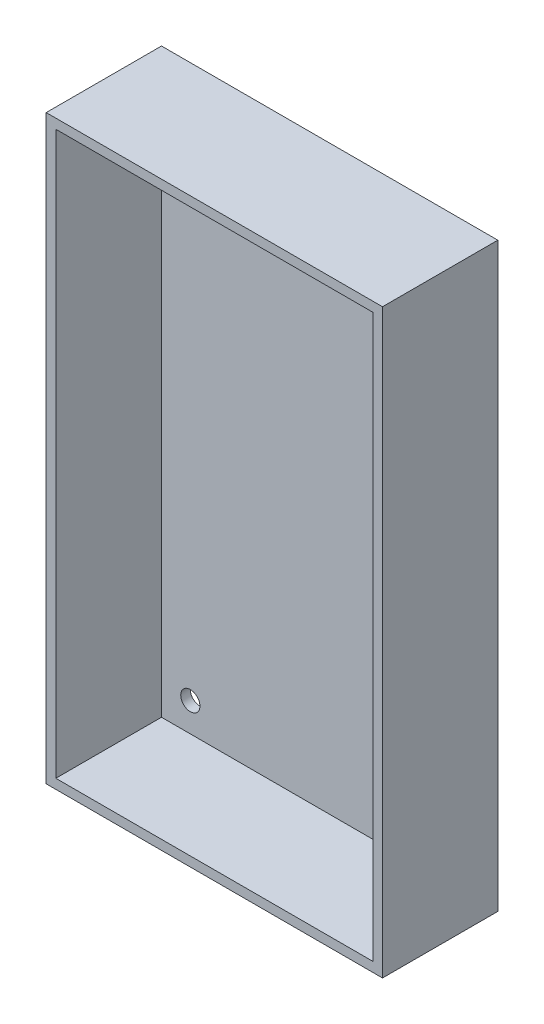
ISO-10303-21;
HEADER;
FILE_DESCRIPTION(('STEP AP214'),'2;1');
FILE_NAME('part.step','',(''),(''),'','','');
FILE_SCHEMA(('AUTOMOTIVE_DESIGN { 1 0 10303 214 1 1 1 1 }'));
ENDSEC;
DATA;
#1=APPLICATION_CONTEXT('core data for automotive mechanical design processes');
#2=APPLICATION_PROTOCOL_DEFINITION('international standard','automotive_design',2000,#1);
#3=PRODUCT_CONTEXT('',#1,'mechanical');
#4=PRODUCT('Part','Part','',(#3));
#5=PRODUCT_RELATED_PRODUCT_CATEGORY('part','',(#4));
#6=PRODUCT_DEFINITION_FORMATION('','',#4);
#7=PRODUCT_DEFINITION_CONTEXT('part definition',#1,'design');
#8=PRODUCT_DEFINITION('design','',#6,#7);
#9=PRODUCT_DEFINITION_SHAPE('','',#8);
#10=(LENGTH_UNIT() NAMED_UNIT(*) SI_UNIT(.MILLI.,.METRE.));
#11=(NAMED_UNIT(*) PLANE_ANGLE_UNIT() SI_UNIT($,.RADIAN.));
#12=(NAMED_UNIT(*) SI_UNIT($,.STERADIAN.) SOLID_ANGLE_UNIT());
#13=UNCERTAINTY_MEASURE_WITH_UNIT(LENGTH_MEASURE(1.E-05),#10,'distance_accuracy_value','');
#14=(GEOMETRIC_REPRESENTATION_CONTEXT(3) GLOBAL_UNCERTAINTY_ASSIGNED_CONTEXT((#13)) GLOBAL_UNIT_ASSIGNED_CONTEXT((#10,
#11,#12)) REPRESENTATION_CONTEXT('',''));
#15=CARTESIAN_POINT('',(0.,0.,0.));
#16=DIRECTION('',(0.,0.,1.));
#17=DIRECTION('',(1.,0.,0.));
#18=AXIS2_PLACEMENT_3D('',#15,#16,#17);
#19=CARTESIAN_POINT('',(-35.,60.5,2.));
#20=DIRECTION('',(0.,1.,0.));
#21=DIRECTION('',(0.,0.,1.));
#22=AXIS2_PLACEMENT_3D('',#19,#20,#21);
#23=PLANE('',#22);
#24=DIRECTION('',(1.,0.,0.));
#25=VECTOR('',#24,1.);
#26=CARTESIAN_POINT('',(-35.,60.5,0.));
#27=LINE('',#26,#25);
#28=CARTESIAN_POINT('',(-35.,60.5,0.));
#29=VERTEX_POINT('',#28);
#30=CARTESIAN_POINT('',(35.,60.5,0.));
#31=VERTEX_POINT('',#30);
#32=EDGE_CURVE('E189',#29,#31,#27,.T.);
#33=ORIENTED_EDGE('',*,*,#32,.F.);
#34=DIRECTION('',(0.,0.,-1.));
#35=VECTOR('',#34,1.);
#36=CARTESIAN_POINT('',(-35.,60.5,2.));
#37=LINE('',#36,#35);
#38=CARTESIAN_POINT('',(-35.,60.5,24.));
#39=VERTEX_POINT('',#38);
#40=EDGE_CURVE('E11',#39,#29,#37,.T.);
#41=ORIENTED_EDGE('',*,*,#40,.F.);
#42=DIRECTION('',(-1.,0.,0.));
#43=VECTOR('',#42,1.);
#44=CARTESIAN_POINT('',(0.,60.5,24.));
#45=LINE('',#44,#43);
#46=CARTESIAN_POINT('',(35.,60.5,24.));
#47=VERTEX_POINT('',#46);
#48=EDGE_CURVE('E127',#47,#39,#45,.T.);
#49=ORIENTED_EDGE('',*,*,#48,.F.);
#50=DIRECTION('',(0.,0.,-1.));
#51=VECTOR('',#50,1.);
#52=CARTESIAN_POINT('',(35.,60.5,2.));
#53=LINE('',#52,#51);
#54=EDGE_CURVE('E112',#47,#31,#53,.T.);
#55=ORIENTED_EDGE('',*,*,#54,.T.);
#56=EDGE_LOOP('',(#33,#41,#49,#55));
#57=FACE_BOUND('',#56,.T.);
#58=ADVANCED_FACE('F47',(#57),#23,.T.);
#59=CARTESIAN_POINT('',(-35.,60.5,2.));
#60=DIRECTION('',(1.,0.,0.));
#61=DIRECTION('',(0.,1.,0.));
#62=AXIS2_PLACEMENT_3D('',#59,#60,#61);
#63=PLANE('',#62);
#64=DIRECTION('',(0.,-1.,0.));
#65=VECTOR('',#64,1.);
#66=CARTESIAN_POINT('',(-35.,60.5,0.));
#67=LINE('',#66,#65);
#68=CARTESIAN_POINT('',(-35.,-60.5,0.));
#69=VERTEX_POINT('',#68);
#70=EDGE_CURVE('E124',#29,#69,#67,.T.);
#71=ORIENTED_EDGE('',*,*,#70,.T.);
#72=DIRECTION('',(0.,0.,-1.));
#73=VECTOR('',#72,1.);
#74=CARTESIAN_POINT('',(-35.,-60.5,2.));
#75=LINE('',#74,#73);
#76=CARTESIAN_POINT('',(-35.,-60.5,24.));
#77=VERTEX_POINT('',#76);
#78=EDGE_CURVE('E56',#77,#69,#75,.T.);
#79=ORIENTED_EDGE('',*,*,#78,.F.);
#80=DIRECTION('',(0.,-1.,0.));
#81=VECTOR('',#80,1.);
#82=CARTESIAN_POINT('',(-35.,0.,24.));
#83=LINE('',#82,#81);
#84=EDGE_CURVE('E131',#39,#77,#83,.T.);
#85=ORIENTED_EDGE('',*,*,#84,.F.);
#86=ORIENTED_EDGE('',*,*,#40,.T.);
#87=EDGE_LOOP('',(#71,#79,#85,#86));
#88=FACE_BOUND('',#87,.T.);
#89=ADVANCED_FACE('F237',(#88),#63,.F.);
#90=CARTESIAN_POINT('',(-35.,-60.5,2.));
#91=DIRECTION('',(0.,1.,0.));
#92=DIRECTION('',(0.,0.,1.));
#93=AXIS2_PLACEMENT_3D('',#90,#91,#92);
#94=PLANE('',#93);
#95=DIRECTION('',(1.,0.,0.));
#96=VECTOR('',#95,1.);
#97=CARTESIAN_POINT('',(-35.,-60.5,0.));
#98=LINE('',#97,#96);
#99=CARTESIAN_POINT('',(35.,-60.5,0.));
#100=VERTEX_POINT('',#99);
#101=EDGE_CURVE('E194',#69,#100,#98,.T.);
#102=ORIENTED_EDGE('',*,*,#101,.T.);
#103=DIRECTION('',(0.,0.,-1.));
#104=VECTOR('',#103,1.);
#105=CARTESIAN_POINT('',(35.,-60.5,2.));
#106=LINE('',#105,#104);
#107=CARTESIAN_POINT('',(35.,-60.5,24.));
#108=VERTEX_POINT('',#107);
#109=EDGE_CURVE('E123',#108,#100,#106,.T.);
#110=ORIENTED_EDGE('',*,*,#109,.F.);
#111=DIRECTION('',(1.,0.,0.));
#112=VECTOR('',#111,1.);
#113=CARTESIAN_POINT('',(0.,-60.5,24.));
#114=LINE('',#113,#112);
#115=EDGE_CURVE('E137',#77,#108,#114,.T.);
#116=ORIENTED_EDGE('',*,*,#115,.F.);
#117=ORIENTED_EDGE('',*,*,#78,.T.);
#118=EDGE_LOOP('',(#102,#110,#116,#117));
#119=FACE_BOUND('',#118,.T.);
#120=ADVANCED_FACE('F241',(#119),#94,.F.);
#121=CARTESIAN_POINT('',(35.,60.5,2.));
#122=DIRECTION('',(1.,0.,0.));
#123=DIRECTION('',(0.,0.,-1.));
#124=AXIS2_PLACEMENT_3D('',#121,#122,#123);
#125=PLANE('',#124);
#126=DIRECTION('',(0.,-1.,0.));
#127=VECTOR('',#126,1.);
#128=CARTESIAN_POINT('',(35.,60.5,0.));
#129=LINE('',#128,#127);
#130=EDGE_CURVE('E118',#31,#100,#129,.T.);
#131=ORIENTED_EDGE('',*,*,#130,.F.);
#132=ORIENTED_EDGE('',*,*,#54,.F.);
#133=DIRECTION('',(0.,1.,0.));
#134=VECTOR('',#133,1.);
#135=CARTESIAN_POINT('',(35.,0.,24.));
#136=LINE('',#135,#134);
#137=EDGE_CURVE('E116',#108,#47,#136,.T.);
#138=ORIENTED_EDGE('',*,*,#137,.F.);
#139=ORIENTED_EDGE('',*,*,#109,.T.);
#140=EDGE_LOOP('',(#131,#132,#138,#139));
#141=FACE_BOUND('',#140,.T.);
#142=ADVANCED_FACE('F114',(#141),#125,.T.);
#143=CARTESIAN_POINT('',(0.,0.,0.));
#144=DIRECTION('',(0.,0.,-1.));
#145=DIRECTION('',(-1.,0.,0.));
#146=AXIS2_PLACEMENT_3D('',#143,#144,#145);
#147=PLANE('',#146);
#148=CARTESIAN_POINT('',(-27.,52.5,0.));
#149=DIRECTION('',(0.,0.,-1.));
#150=DIRECTION('',(1.,0.,0.));
#151=AXIS2_PLACEMENT_3D('',#148,#149,#150);
#152=CIRCLE('',#151,2.);
#153=CARTESIAN_POINT('',(-25.,52.5,0.));
#154=VERTEX_POINT('',#153);
#155=EDGE_CURVE('E267',#154,#154,#152,.T.);
#156=ORIENTED_EDGE('',*,*,#155,.F.);
#157=EDGE_LOOP('',(#156));
#158=FACE_BOUND('',#157,.T.);
#159=CARTESIAN_POINT('',(-27.,-52.5,0.));
#160=DIRECTION('',(0.,0.,-1.));
#161=DIRECTION('',(-1.,0.,0.));
#162=AXIS2_PLACEMENT_3D('',#159,#160,#161);
#163=CIRCLE('',#162,2.);
#164=CARTESIAN_POINT('',(-29.,-52.5,0.));
#165=VERTEX_POINT('',#164);
#166=EDGE_CURVE('E271',#165,#165,#163,.T.);
#167=ORIENTED_EDGE('',*,*,#166,.F.);
#168=EDGE_LOOP('',(#167));
#169=FACE_BOUND('',#168,.T.);
#170=CARTESIAN_POINT('',(27.,-52.5,0.));
#171=DIRECTION('',(0.,0.,-1.));
#172=DIRECTION('',(1.,0.,0.));
#173=AXIS2_PLACEMENT_3D('',#170,#171,#172);
#174=CIRCLE('',#173,2.);
#175=CARTESIAN_POINT('',(29.,-52.5,0.));
#176=VERTEX_POINT('',#175);
#177=EDGE_CURVE('E275',#176,#176,#174,.T.);
#178=ORIENTED_EDGE('',*,*,#177,.F.);
#179=EDGE_LOOP('',(#178));
#180=FACE_BOUND('',#179,.T.);
#181=CARTESIAN_POINT('',(27.,52.5,0.));
#182=DIRECTION('',(0.,0.,-1.));
#183=DIRECTION('',(-1.,0.,0.));
#184=AXIS2_PLACEMENT_3D('',#181,#182,#183);
#185=CIRCLE('',#184,2.);
#186=CARTESIAN_POINT('',(25.,52.5,0.));
#187=VERTEX_POINT('',#186);
#188=EDGE_CURVE('E145',#187,#187,#185,.T.);
#189=ORIENTED_EDGE('',*,*,#188,.F.);
#190=EDGE_LOOP('',(#189));
#191=FACE_BOUND('',#190,.T.);
#192=ORIENTED_EDGE('',*,*,#32,.T.);
#193=ORIENTED_EDGE('',*,*,#130,.T.);
#194=ORIENTED_EDGE('',*,*,#101,.F.);
#195=ORIENTED_EDGE('',*,*,#70,.F.);
#196=EDGE_LOOP('',(#192,#193,#194,#195));
#197=FACE_BOUND('',#196,.T.);
#198=ADVANCED_FACE('F249',(#158,#169,#180,#191,#197),#147,.T.);
#199=CARTESIAN_POINT('',(0.,58.5,24.));
#200=DIRECTION('',(0.,1.,0.));
#201=DIRECTION('',(0.,0.,1.));
#202=AXIS2_PLACEMENT_3D('',#199,#200,#201);
#203=PLANE('',#202);
#204=DIRECTION('',(1.,0.,0.));
#205=VECTOR('',#204,1.);
#206=CARTESIAN_POINT('',(0.,58.5,2.));
#207=LINE('',#206,#205);
#208=CARTESIAN_POINT('',(-33.,58.5,2.));
#209=VERTEX_POINT('',#208);
#210=CARTESIAN_POINT('',(33.,58.5,2.));
#211=VERTEX_POINT('',#210);
#212=EDGE_CURVE('E168',#209,#211,#207,.T.);
#213=ORIENTED_EDGE('',*,*,#212,.T.);
#214=DIRECTION('',(0.,0.,-1.));
#215=VECTOR('',#214,1.);
#216=CARTESIAN_POINT('',(33.,58.5,24.));
#217=LINE('',#216,#215);
#218=CARTESIAN_POINT('',(33.,58.5,24.));
#219=VERTEX_POINT('',#218);
#220=EDGE_CURVE('E186',#219,#211,#217,.T.);
#221=ORIENTED_EDGE('',*,*,#220,.F.);
#222=DIRECTION('',(1.,0.,0.));
#223=VECTOR('',#222,1.);
#224=CARTESIAN_POINT('',(0.,58.5,24.));
#225=LINE('',#224,#223);
#226=CARTESIAN_POINT('',(-33.,58.5,24.));
#227=VERTEX_POINT('',#226);
#228=EDGE_CURVE('E152',#227,#219,#225,.T.);
#229=ORIENTED_EDGE('',*,*,#228,.F.);
#230=DIRECTION('',(0.,0.,-1.));
#231=VECTOR('',#230,1.);
#232=CARTESIAN_POINT('',(-33.,58.5,24.));
#233=LINE('',#232,#231);
#234=EDGE_CURVE('E167',#227,#209,#233,.T.);
#235=ORIENTED_EDGE('',*,*,#234,.T.);
#236=EDGE_LOOP('',(#213,#221,#229,#235));
#237=FACE_BOUND('',#236,.T.);
#238=ADVANCED_FACE('F256',(#237),#203,.F.);
#239=CARTESIAN_POINT('',(33.,0.,24.));
#240=DIRECTION('',(1.,0.,0.));
#241=DIRECTION('',(0.,0.,-1.));
#242=AXIS2_PLACEMENT_3D('',#239,#240,#241);
#243=PLANE('',#242);
#244=DIRECTION('',(0.,-1.,0.));
#245=VECTOR('',#244,1.);
#246=CARTESIAN_POINT('',(33.,0.,2.));
#247=LINE('',#246,#245);
#248=CARTESIAN_POINT('',(33.,-58.5,2.));
#249=VERTEX_POINT('',#248);
#250=EDGE_CURVE('E172',#211,#249,#247,.T.);
#251=ORIENTED_EDGE('',*,*,#250,.T.);
#252=DIRECTION('',(0.,0.,-1.));
#253=VECTOR('',#252,1.);
#254=CARTESIAN_POINT('',(33.,-58.5,24.));
#255=LINE('',#254,#253);
#256=CARTESIAN_POINT('',(33.,-58.5,24.));
#257=VERTEX_POINT('',#256);
#258=EDGE_CURVE('E183',#257,#249,#255,.T.);
#259=ORIENTED_EDGE('',*,*,#258,.F.);
#260=DIRECTION('',(0.,-1.,0.));
#261=VECTOR('',#260,1.);
#262=CARTESIAN_POINT('',(33.,0.,24.));
#263=LINE('',#262,#261);
#264=EDGE_CURVE('E156',#219,#257,#263,.T.);
#265=ORIENTED_EDGE('',*,*,#264,.F.);
#266=ORIENTED_EDGE('',*,*,#220,.T.);
#267=EDGE_LOOP('',(#251,#259,#265,#266));
#268=FACE_BOUND('',#267,.T.);
#269=ADVANCED_FACE('F262',(#268),#243,.F.);
#270=CARTESIAN_POINT('',(0.,-58.5,24.));
#271=DIRECTION('',(0.,1.,0.));
#272=DIRECTION('',(0.,0.,1.));
#273=AXIS2_PLACEMENT_3D('',#270,#271,#272);
#274=PLANE('',#273);
#275=DIRECTION('',(1.,0.,0.));
#276=VECTOR('',#275,1.);
#277=CARTESIAN_POINT('',(0.,-58.5,2.));
#278=LINE('',#277,#276);
#279=CARTESIAN_POINT('',(-33.,-58.5,2.));
#280=VERTEX_POINT('',#279);
#281=EDGE_CURVE('E64',#280,#249,#278,.T.);
#282=ORIENTED_EDGE('',*,*,#281,.F.);
#283=DIRECTION('',(0.,0.,-1.));
#284=VECTOR('',#283,1.);
#285=CARTESIAN_POINT('',(-33.,-58.5,24.));
#286=LINE('',#285,#284);
#287=CARTESIAN_POINT('',(-33.,-58.5,24.));
#288=VERTEX_POINT('',#287);
#289=EDGE_CURVE('E180',#288,#280,#286,.T.);
#290=ORIENTED_EDGE('',*,*,#289,.F.);
#291=DIRECTION('',(1.,0.,0.));
#292=VECTOR('',#291,1.);
#293=CARTESIAN_POINT('',(0.,-58.5,24.));
#294=LINE('',#293,#292);
#295=EDGE_CURVE('E159',#288,#257,#294,.T.);
#296=ORIENTED_EDGE('',*,*,#295,.T.);
#297=ORIENTED_EDGE('',*,*,#258,.T.);
#298=EDGE_LOOP('',(#282,#290,#296,#297));
#299=FACE_BOUND('',#298,.T.);
#300=ADVANCED_FACE('F307',(#299),#274,.T.);
#301=CARTESIAN_POINT('',(-33.,0.,24.));
#302=DIRECTION('',(1.,0.,0.));
#303=DIRECTION('',(0.,0.,-1.));
#304=AXIS2_PLACEMENT_3D('',#301,#302,#303);
#305=PLANE('',#304);
#306=DIRECTION('',(0.,-1.,0.));
#307=VECTOR('',#306,1.);
#308=CARTESIAN_POINT('',(-33.,0.,2.));
#309=LINE('',#308,#307);
#310=EDGE_CURVE('E139',#209,#280,#309,.T.);
#311=ORIENTED_EDGE('',*,*,#310,.F.);
#312=ORIENTED_EDGE('',*,*,#234,.F.);
#313=DIRECTION('',(0.,-1.,0.));
#314=VECTOR('',#313,1.);
#315=CARTESIAN_POINT('',(-33.,0.,24.));
#316=LINE('',#315,#314);
#317=EDGE_CURVE('E163',#227,#288,#316,.T.);
#318=ORIENTED_EDGE('',*,*,#317,.T.);
#319=ORIENTED_EDGE('',*,*,#289,.T.);
#320=EDGE_LOOP('',(#311,#312,#318,#319));
#321=FACE_BOUND('',#320,.T.);
#322=ADVANCED_FACE('F305',(#321),#305,.T.);
#323=CARTESIAN_POINT('',(0.,0.,24.));
#324=DIRECTION('',(0.,0.,1.));
#325=DIRECTION('',(1.,0.,0.));
#326=AXIS2_PLACEMENT_3D('',#323,#324,#325);
#327=PLANE('',#326);
#328=ORIENTED_EDGE('',*,*,#137,.T.);
#329=ORIENTED_EDGE('',*,*,#48,.T.);
#330=ORIENTED_EDGE('',*,*,#84,.T.);
#331=ORIENTED_EDGE('',*,*,#115,.T.);
#332=EDGE_LOOP('',(#328,#329,#330,#331));
#333=FACE_BOUND('',#332,.T.);
#334=ORIENTED_EDGE('',*,*,#228,.T.);
#335=ORIENTED_EDGE('',*,*,#264,.T.);
#336=ORIENTED_EDGE('',*,*,#295,.F.);
#337=ORIENTED_EDGE('',*,*,#317,.F.);
#338=EDGE_LOOP('',(#334,#335,#336,#337));
#339=FACE_BOUND('',#338,.T.);
#340=ADVANCED_FACE('F134',(#333,#339),#327,.T.);
#341=CARTESIAN_POINT('',(0.,0.,2.));
#342=DIRECTION('',(0.,0.,-1.));
#343=DIRECTION('',(-1.,0.,0.));
#344=AXIS2_PLACEMENT_3D('',#341,#342,#343);
#345=PLANE('',#344);
#346=CARTESIAN_POINT('',(-27.,52.5,2.));
#347=DIRECTION('',(0.,0.,-1.));
#348=DIRECTION('',(-1.,0.,0.));
#349=AXIS2_PLACEMENT_3D('',#346,#347,#348);
#350=CIRCLE('',#349,2.);
#351=CARTESIAN_POINT('',(-29.,52.5,2.));
#352=VERTEX_POINT('',#351);
#353=EDGE_CURVE('E50',#352,#352,#350,.T.);
#354=ORIENTED_EDGE('',*,*,#353,.T.);
#355=EDGE_LOOP('',(#354));
#356=FACE_BOUND('',#355,.T.);
#357=CARTESIAN_POINT('',(-27.,-52.5,2.));
#358=DIRECTION('',(0.,0.,-1.));
#359=DIRECTION('',(-1.,0.,0.));
#360=AXIS2_PLACEMENT_3D('',#357,#358,#359);
#361=CIRCLE('',#360,2.);
#362=CARTESIAN_POINT('',(-29.,-52.5,2.));
#363=VERTEX_POINT('',#362);
#364=EDGE_CURVE('E212',#363,#363,#361,.T.);
#365=ORIENTED_EDGE('',*,*,#364,.T.);
#366=EDGE_LOOP('',(#365));
#367=FACE_BOUND('',#366,.T.);
#368=CARTESIAN_POINT('',(27.,-52.5,2.));
#369=DIRECTION('',(0.,0.,-1.));
#370=DIRECTION('',(-1.,0.,0.));
#371=AXIS2_PLACEMENT_3D('',#368,#369,#370);
#372=CIRCLE('',#371,2.);
#373=CARTESIAN_POINT('',(25.,-52.5,2.));
#374=VERTEX_POINT('',#373);
#375=EDGE_CURVE('E209',#374,#374,#372,.T.);
#376=ORIENTED_EDGE('',*,*,#375,.T.);
#377=EDGE_LOOP('',(#376));
#378=FACE_BOUND('',#377,.T.);
#379=CARTESIAN_POINT('',(27.,52.5,2.));
#380=DIRECTION('',(0.,0.,-1.));
#381=DIRECTION('',(-1.,0.,0.));
#382=AXIS2_PLACEMENT_3D('',#379,#380,#381);
#383=CIRCLE('',#382,2.);
#384=CARTESIAN_POINT('',(25.,52.5,2.));
#385=VERTEX_POINT('',#384);
#386=EDGE_CURVE('E205',#385,#385,#383,.T.);
#387=ORIENTED_EDGE('',*,*,#386,.T.);
#388=EDGE_LOOP('',(#387));
#389=FACE_BOUND('',#388,.T.);
#390=ORIENTED_EDGE('',*,*,#212,.F.);
#391=ORIENTED_EDGE('',*,*,#310,.T.);
#392=ORIENTED_EDGE('',*,*,#281,.T.);
#393=ORIENTED_EDGE('',*,*,#250,.F.);
#394=EDGE_LOOP('',(#390,#391,#392,#393));
#395=FACE_BOUND('',#394,.T.);
#396=ADVANCED_FACE('F221',(#356,#367,#378,#389,#395),#345,.F.);
#397=CARTESIAN_POINT('',(27.,52.5,10.));
#398=DIRECTION('',(0.,0.,-1.));
#399=DIRECTION('',(-1.,0.,0.));
#400=AXIS2_PLACEMENT_3D('',#397,#398,#399);
#401=CYLINDRICAL_SURFACE('',#400,2.);
#402=ORIENTED_EDGE('',*,*,#188,.T.);
#403=EDGE_LOOP('',(#402));
#404=FACE_BOUND('',#403,.T.);
#405=ORIENTED_EDGE('',*,*,#386,.F.);
#406=EDGE_LOOP('',(#405));
#407=FACE_BOUND('',#406,.T.);
#408=ADVANCED_FACE('F291',(#404,#407),#401,.F.);
#409=CARTESIAN_POINT('',(27.,-52.5,10.));
#410=DIRECTION('',(0.,0.,-1.));
#411=DIRECTION('',(-1.,0.,0.));
#412=AXIS2_PLACEMENT_3D('',#409,#410,#411);
#413=CYLINDRICAL_SURFACE('',#412,2.);
#414=ORIENTED_EDGE('',*,*,#177,.T.);
#415=EDGE_LOOP('',(#414));
#416=FACE_BOUND('',#415,.T.);
#417=ORIENTED_EDGE('',*,*,#375,.F.);
#418=EDGE_LOOP('',(#417));
#419=FACE_BOUND('',#418,.T.);
#420=ADVANCED_FACE('F231',(#416,#419),#413,.F.);
#421=CARTESIAN_POINT('',(-27.,-52.5,10.));
#422=DIRECTION('',(0.,0.,-1.));
#423=DIRECTION('',(-1.,0.,0.));
#424=AXIS2_PLACEMENT_3D('',#421,#422,#423);
#425=CYLINDRICAL_SURFACE('',#424,2.);
#426=ORIENTED_EDGE('',*,*,#166,.T.);
#427=EDGE_LOOP('',(#426));
#428=FACE_BOUND('',#427,.T.);
#429=ORIENTED_EDGE('',*,*,#364,.F.);
#430=EDGE_LOOP('',(#429));
#431=FACE_BOUND('',#430,.T.);
#432=ADVANCED_FACE('F225',(#428,#431),#425,.F.);
#433=CARTESIAN_POINT('',(-27.,52.5,10.));
#434=DIRECTION('',(0.,0.,-1.));
#435=DIRECTION('',(-1.,0.,0.));
#436=AXIS2_PLACEMENT_3D('',#433,#434,#435);
#437=CYLINDRICAL_SURFACE('',#436,2.);
#438=ORIENTED_EDGE('',*,*,#155,.T.);
#439=EDGE_LOOP('',(#438));
#440=FACE_BOUND('',#439,.T.);
#441=ORIENTED_EDGE('',*,*,#353,.F.);
#442=EDGE_LOOP('',(#441));
#443=FACE_BOUND('',#442,.T.);
#444=ADVANCED_FACE('F223',(#440,#443),#437,.F.);
#445=CLOSED_SHELL('',(#58,#89,#120,#142,#198,#238,#269,#300,#322,#340,#396,#408,#420,#432,#444));
#446=MANIFOLD_SOLID_BREP('B2',#445);
#447=ADVANCED_BREP_SHAPE_REPRESENTATION('',(#18,#446),#14);
#448=SHAPE_DEFINITION_REPRESENTATION(#9,#447);
ENDSEC;
END-ISO-10303-21;
